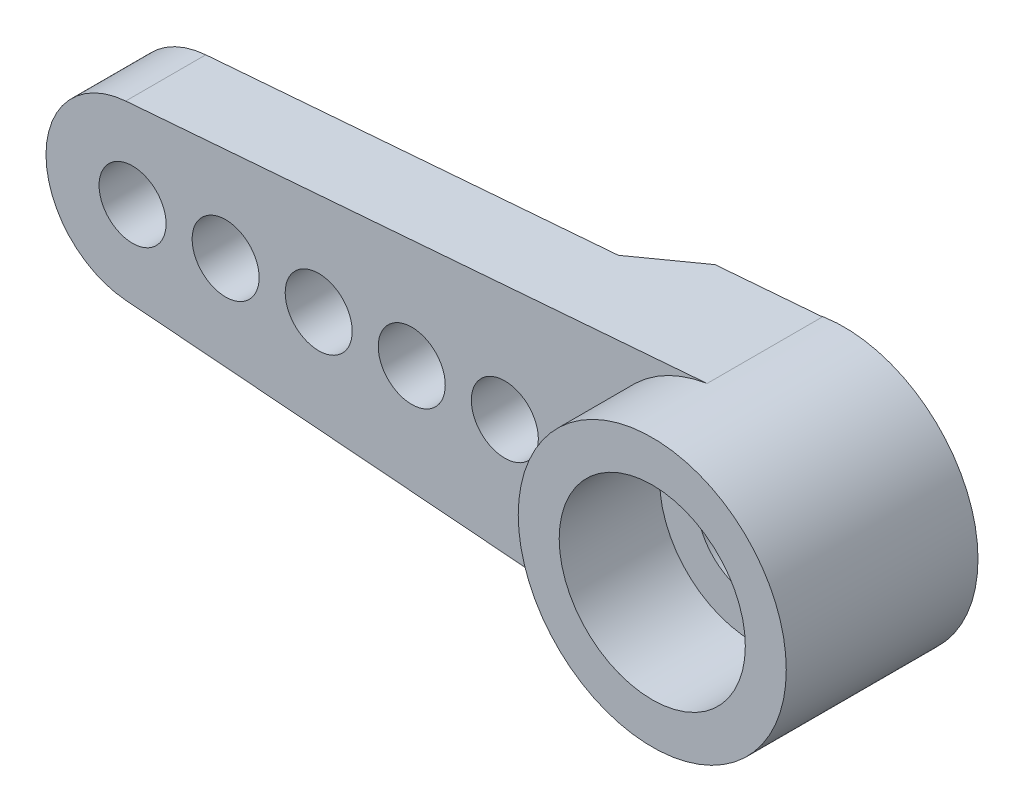
ISO-10303-21;
HEADER;
FILE_DESCRIPTION(('STEP AP214'),'2;1');
FILE_NAME('part.step','',(''),(''),'','','');
FILE_SCHEMA(('AUTOMOTIVE_DESIGN { 1 0 10303 214 1 1 1 1 }'));
ENDSEC;
DATA;
#1=APPLICATION_CONTEXT('core data for automotive mechanical design processes');
#2=APPLICATION_PROTOCOL_DEFINITION('international standard','automotive_design',2000,#1);
#3=PRODUCT_CONTEXT('',#1,'mechanical');
#4=PRODUCT('Part','Part','',(#3));
#5=PRODUCT_RELATED_PRODUCT_CATEGORY('part','',(#4));
#6=PRODUCT_DEFINITION_FORMATION('','',#4);
#7=PRODUCT_DEFINITION_CONTEXT('part definition',#1,'design');
#8=PRODUCT_DEFINITION('design','',#6,#7);
#9=PRODUCT_DEFINITION_SHAPE('','',#8);
#10=(LENGTH_UNIT() NAMED_UNIT(*) SI_UNIT(.MILLI.,.METRE.));
#11=(NAMED_UNIT(*) PLANE_ANGLE_UNIT() SI_UNIT($,.RADIAN.));
#12=(NAMED_UNIT(*) SI_UNIT($,.STERADIAN.) SOLID_ANGLE_UNIT());
#13=UNCERTAINTY_MEASURE_WITH_UNIT(LENGTH_MEASURE(1.E-05),#10,'distance_accuracy_value','');
#14=(GEOMETRIC_REPRESENTATION_CONTEXT(3) GLOBAL_UNCERTAINTY_ASSIGNED_CONTEXT((#13)) GLOBAL_UNIT_ASSIGNED_CONTEXT((#10,
#11,#12)) REPRESENTATION_CONTEXT('',''));
#15=CARTESIAN_POINT('',(0.,0.,0.));
#16=DIRECTION('',(0.,0.,1.));
#17=DIRECTION('',(1.,0.,0.));
#18=AXIS2_PLACEMENT_3D('',#15,#16,#17);
#19=CARTESIAN_POINT('',(0.,0.,-0.15));
#20=DIRECTION('',(0.,0.,1.));
#21=DIRECTION('',(1.,0.,0.));
#22=AXIS2_PLACEMENT_3D('',#19,#20,#21);
#23=CYLINDRICAL_SURFACE('',#22,3.6);
#24=CARTESIAN_POINT('',(0.,0.,2.8));
#25=DIRECTION('',(0.,0.,1.));
#26=DIRECTION('',(1.,0.,0.));
#27=AXIS2_PLACEMENT_3D('',#24,#25,#26);
#28=CIRCLE('',#27,3.6);
#29=CARTESIAN_POINT('',(3.6,0.,2.8));
#30=VERTEX_POINT('',#29);
#31=EDGE_CURVE('E185',#30,#30,#28,.T.);
#32=ORIENTED_EDGE('',*,*,#31,.F.);
#33=EDGE_LOOP('',(#32));
#34=FACE_BOUND('',#33,.T.);
#35=DIRECTION('',(0.,0.,1.));
#36=VECTOR('',#35,1.);
#37=CARTESIAN_POINT('',(-3.57770876399966,-0.400000000000002,-2.34));
#38=LINE('',#37,#36);
#39=CARTESIAN_POINT('',(-3.57770876399966,-0.400000000000002,-2.2688952548898));
#40=VERTEX_POINT('',#39);
#41=CARTESIAN_POINT('',(-3.57770876399966,-0.400000000000002,-1.39));
#42=VERTEX_POINT('',#41);
#43=EDGE_CURVE('E283',#40,#42,#38,.T.);
#44=ORIENTED_EDGE('',*,*,#43,.F.);
#45=CARTESIAN_POINT('',(0.,0.,-4.3344863728671));
#46=DIRECTION('',(-0.500000000000001,0.,-0.866025403784438));
#47=DIRECTION('',(-0.866025403784438,0.,0.500000000000001));
#48=AXIS2_PLACEMENT_3D('',#45,#46,#47);
#49=ELLIPSE('',#48,4.15692193816531,3.6);
#50=CARTESIAN_POINT('',(-3.43723122473388,-1.07025301107469,-2.35));
#51=VERTEX_POINT('',#50);
#52=EDGE_CURVE('E61',#40,#51,#49,.F.);
#53=ORIENTED_EDGE('',*,*,#52,.T.);
#54=CARTESIAN_POINT('',(0.,0.,-2.35));
#55=DIRECTION('',(0.,0.,-1.));
#56=DIRECTION('',(-1.,0.,0.));
#57=AXIS2_PLACEMENT_3D('',#54,#55,#56);
#58=CIRCLE('',#57,3.6);
#59=CARTESIAN_POINT('',(-3.43723122473388,1.07025301107469,-2.35));
#60=VERTEX_POINT('',#59);
#61=EDGE_CURVE('E182',#60,#51,#58,.T.);
#62=ORIENTED_EDGE('',*,*,#61,.F.);
#63=CARTESIAN_POINT('',(-3.57770876399966,0.399999999999998,-2.2688952548898));
#64=VERTEX_POINT('',#63);
#65=EDGE_CURVE('E356',#60,#64,#49,.F.);
#66=ORIENTED_EDGE('',*,*,#65,.T.);
#67=DIRECTION('',(0.,0.,1.));
#68=VECTOR('',#67,1.);
#69=CARTESIAN_POINT('',(-3.57770876399966,0.399999999999998,-2.34));
#70=LINE('',#69,#68);
#71=CARTESIAN_POINT('',(-3.57770876399966,0.399999999999998,-1.39));
#72=VERTEX_POINT('',#71);
#73=EDGE_CURVE('E279',#64,#72,#70,.T.);
#74=ORIENTED_EDGE('',*,*,#73,.T.);
#75=CARTESIAN_POINT('',(0.,0.,-1.39));
#76=DIRECTION('',(0.,0.,1.));
#77=DIRECTION('',(1.,0.,0.));
#78=AXIS2_PLACEMENT_3D('',#75,#76,#77);
#79=CIRCLE('',#78,3.6);
#80=CARTESIAN_POINT('',(-2.68692855753543,2.39591630210669,-1.39));
#81=VERTEX_POINT('',#80);
#82=EDGE_CURVE('E170',#72,#81,#79,.F.);
#83=ORIENTED_EDGE('',*,*,#82,.T.);
#84=DIRECTION('',(0.,0.,1.));
#85=VECTOR('',#84,1.);
#86=CARTESIAN_POINT('',(-2.68692855753543,2.39591630210669,-2.34));
#87=LINE('',#86,#85);
#88=CARTESIAN_POINT('',(-2.68692855753543,2.39591630210669,-2.34));
#89=VERTEX_POINT('',#88);
#90=EDGE_CURVE('E372',#89,#81,#87,.T.);
#91=ORIENTED_EDGE('',*,*,#90,.F.);
#92=CARTESIAN_POINT('',(0.,0.,-2.34));
#93=DIRECTION('',(0.,0.,-1.));
#94=DIRECTION('',(-1.,0.,0.));
#95=AXIS2_PLACEMENT_3D('',#92,#93,#94);
#96=CIRCLE('',#95,3.6);
#97=CARTESIAN_POINT('',(-0.566912183951404,3.55508235849571,-2.34));
#98=VERTEX_POINT('',#97);
#99=EDGE_CURVE('E269',#98,#89,#96,.F.);
#100=ORIENTED_EDGE('',*,*,#99,.F.);
#101=DIRECTION('',(0.,0.,1.));
#102=VECTOR('',#101,1.);
#103=CARTESIAN_POINT('',(-0.566912183951404,3.55508235849571,-6.44));
#104=LINE('',#103,#102);
#105=CARTESIAN_POINT('',(-0.566912183951404,3.55508235849571,0.76));
#106=VERTEX_POINT('',#105);
#107=EDGE_CURVE('E172',#98,#106,#104,.T.);
#108=ORIENTED_EDGE('',*,*,#107,.T.);
#109=CARTESIAN_POINT('',(0.,0.,0.76));
#110=DIRECTION('',(0.,0.,-1.));
#111=DIRECTION('',(-1.,0.,0.));
#112=AXIS2_PLACEMENT_3D('',#109,#110,#111);
#113=CIRCLE('',#112,3.6);
#114=CARTESIAN_POINT('',(-0.566912183951398,-3.55508235849572,0.76));
#115=VERTEX_POINT('',#114);
#116=EDGE_CURVE('E46',#106,#115,#113,.F.);
#117=ORIENTED_EDGE('',*,*,#116,.T.);
#118=DIRECTION('',(0.,0.,1.));
#119=VECTOR('',#118,1.);
#120=CARTESIAN_POINT('',(-0.566912183951398,-3.55508235849572,-6.44));
#121=LINE('',#120,#119);
#122=CARTESIAN_POINT('',(-0.566912183951395,-3.55508235849572,-2.34));
#123=VERTEX_POINT('',#122);
#124=EDGE_CURVE('E243',#123,#115,#121,.T.);
#125=ORIENTED_EDGE('',*,*,#124,.F.);
#126=CARTESIAN_POINT('',(0.,0.,-2.34));
#127=DIRECTION('',(0.,0.,-1.));
#128=DIRECTION('',(-1.,0.,0.));
#129=AXIS2_PLACEMENT_3D('',#126,#127,#128);
#130=CIRCLE('',#129,3.6);
#131=CARTESIAN_POINT('',(-2.68692855753543,-2.39591630210669,-2.34));
#132=VERTEX_POINT('',#131);
#133=EDGE_CURVE('E383',#132,#123,#130,.F.);
#134=ORIENTED_EDGE('',*,*,#133,.F.);
#135=DIRECTION('',(0.,0.,1.));
#136=VECTOR('',#135,1.);
#137=CARTESIAN_POINT('',(-2.68692855753543,-2.39591630210669,-2.34));
#138=LINE('',#137,#136);
#139=CARTESIAN_POINT('',(-2.68692855753543,-2.39591630210669,-1.39));
#140=VERTEX_POINT('',#139);
#141=EDGE_CURVE('E202',#132,#140,#138,.T.);
#142=ORIENTED_EDGE('',*,*,#141,.T.);
#143=EDGE_CURVE('E176',#140,#42,#79,.F.);
#144=ORIENTED_EDGE('',*,*,#143,.T.);
#145=EDGE_LOOP('',(#44,#53,#62,#66,#74,#83,#91,#100,#108,#117,#125,#134,#142,#144));
#146=FACE_BOUND('',#145,.T.);
#147=ADVANCED_FACE('F39',(#34,#146),#23,.T.);
#148=CARTESIAN_POINT('',(0.,0.,-2.35));
#149=DIRECTION('',(0.,0.,-1.));
#150=DIRECTION('',(-1.,0.,0.));
#151=AXIS2_PLACEMENT_3D('',#148,#149,#150);
#152=PLANE('',#151);
#153=CARTESIAN_POINT('',(0.,0.,-2.35));
#154=DIRECTION('',(0.,0.,-1.));
#155=DIRECTION('',(-1.,0.,0.));
#156=AXIS2_PLACEMENT_3D('',#153,#154,#155);
#157=CIRCLE('',#156,2.45);
#158=CARTESIAN_POINT('',(-2.45,0.,-2.35));
#159=VERTEX_POINT('',#158);
#160=EDGE_CURVE('E179',#159,#159,#157,.T.);
#161=ORIENTED_EDGE('',*,*,#160,.F.);
#162=EDGE_LOOP('',(#161));
#163=FACE_BOUND('',#162,.T.);
#164=ORIENTED_EDGE('',*,*,#61,.T.);
#165=DIRECTION('',(0.,1.,0.));
#166=VECTOR('',#165,1.);
#167=CARTESIAN_POINT('',(-3.43723122473388,0.,-2.35));
#168=LINE('',#167,#166);
#169=EDGE_CURVE('E354',#51,#60,#168,.T.);
#170=ORIENTED_EDGE('',*,*,#169,.T.);
#171=EDGE_LOOP('',(#164,#170));
#172=FACE_BOUND('',#171,.T.);
#173=ADVANCED_FACE('F313',(#163,#172),#152,.T.);
#174=CARTESIAN_POINT('',(-0.283456091975701,3.57754117924786,-6.44));
#175=DIRECTION('',(-0.0789845638086307,0.99687583914947,0.));
#176=DIRECTION('',(-0.99687583914947,-0.0789845638086307,0.));
#177=AXIS2_PLACEMENT_3D('',#174,#175,#176);
#178=PLANE('',#177);
#179=DIRECTION('',(0.99687583914947,0.0789845638086307,0.));
#180=VECTOR('',#179,1.);
#181=CARTESIAN_POINT('',(-0.283456091975701,3.57754117924786,-2.34));
#182=LINE('',#181,#180);
#183=CARTESIAN_POINT('',(-3.45455173280957,3.32628861985148,-2.34));
#184=VERTEX_POINT('',#183);
#185=EDGE_CURVE('E160',#184,#98,#182,.T.);
#186=ORIENTED_EDGE('',*,*,#185,.F.);
#187=DIRECTION('',(-0.863993823839445,-0.0684560429988286,0.498827066771879));
#188=VECTOR('',#187,1.);
#189=CARTESIAN_POINT('',(0.694517488461674,3.65502807744886,-4.73546623178735));
#190=LINE('',#189,#188);
#191=CARTESIAN_POINT('',(-5.1,3.19591630210669,-1.39));
#192=VERTEX_POINT('',#191);
#193=EDGE_CURVE('E144',#184,#192,#190,.T.);
#194=ORIENTED_EDGE('',*,*,#193,.T.);
#195=DIRECTION('',(-0.99687583914947,-0.0789845638086307,0.));
#196=VECTOR('',#195,1.);
#197=CARTESIAN_POINT('',(-18.2106783638103,2.15712975404036,-1.39));
#198=LINE('',#197,#196);
#199=CARTESIAN_POINT('',(-16.1836391108551,2.31773632602252,-1.39));
#200=VERTEX_POINT('',#199);
#201=EDGE_CURVE('E157',#192,#200,#198,.T.);
#202=ORIENTED_EDGE('',*,*,#201,.T.);
#203=DIRECTION('',(0.,0.,1.));
#204=VECTOR('',#203,1.);
#205=CARTESIAN_POINT('',(-16.1836391108551,2.31773632602252,-6.44));
#206=LINE('',#205,#204);
#207=CARTESIAN_POINT('',(-16.1836391108551,2.31773632602252,0.76));
#208=VERTEX_POINT('',#207);
#209=EDGE_CURVE('E245',#200,#208,#206,.T.);
#210=ORIENTED_EDGE('',*,*,#209,.T.);
#211=DIRECTION('',(-0.99687583914947,-0.0789845638086307,0.));
#212=VECTOR('',#211,1.);
#213=CARTESIAN_POINT('',(-0.283456091975701,3.57754117924786,0.76));
#214=LINE('',#213,#212);
#215=EDGE_CURVE('E240',#106,#208,#214,.T.);
#216=ORIENTED_EDGE('',*,*,#215,.F.);
#217=ORIENTED_EDGE('',*,*,#107,.F.);
#218=EDGE_LOOP('',(#186,#194,#202,#210,#216,#217));
#219=FACE_BOUND('',#218,.T.);
#220=ADVANCED_FACE('F156',(#219),#178,.T.);
#221=CARTESIAN_POINT('',(-0.283456091975701,-3.57754117924786,-6.44));
#222=DIRECTION('',(0.0789845638086307,0.99687583914947,0.));
#223=DIRECTION('',(-0.99687583914947,0.0789845638086307,0.));
#224=AXIS2_PLACEMENT_3D('',#221,#222,#223);
#225=PLANE('',#224);
#226=DIRECTION('',(-0.863993823839445,0.0684560429988286,0.498827066771879));
#227=VECTOR('',#226,1.);
#228=CARTESIAN_POINT('',(0.694517488461674,-3.65502807744886,-4.73546623178735));
#229=LINE('',#228,#227);
#230=CARTESIAN_POINT('',(-3.45455173280957,-3.32628861985148,-2.34));
#231=VERTEX_POINT('',#230);
#232=CARTESIAN_POINT('',(-5.1,-3.19591630210669,-1.39));
#233=VERTEX_POINT('',#232);
#234=EDGE_CURVE('E152',#231,#233,#229,.T.);
#235=ORIENTED_EDGE('',*,*,#234,.F.);
#236=DIRECTION('',(-0.99687583914947,0.0789845638086307,0.));
#237=VECTOR('',#236,1.);
#238=CARTESIAN_POINT('',(-0.283456091975701,-3.57754117924786,-2.34));
#239=LINE('',#238,#237);
#240=EDGE_CURVE('E256',#123,#231,#239,.T.);
#241=ORIENTED_EDGE('',*,*,#240,.F.);
#242=ORIENTED_EDGE('',*,*,#124,.T.);
#243=DIRECTION('',(-0.99687583914947,0.0789845638086307,0.));
#244=VECTOR('',#243,1.);
#245=CARTESIAN_POINT('',(-0.283456091975701,-3.57754117924786,0.76));
#246=LINE('',#245,#244);
#247=CARTESIAN_POINT('',(-16.1836391108551,-2.31773632602252,0.76));
#248=VERTEX_POINT('',#247);
#249=EDGE_CURVE('E233',#115,#248,#246,.T.);
#250=ORIENTED_EDGE('',*,*,#249,.T.);
#251=DIRECTION('',(0.,0.,1.));
#252=VECTOR('',#251,1.);
#253=CARTESIAN_POINT('',(-16.1836391108551,-2.31773632602252,-6.44));
#254=LINE('',#253,#252);
#255=CARTESIAN_POINT('',(-16.1836391108551,-2.31773632602252,-1.39));
#256=VERTEX_POINT('',#255);
#257=EDGE_CURVE('E247',#256,#248,#254,.T.);
#258=ORIENTED_EDGE('',*,*,#257,.F.);
#259=DIRECTION('',(-0.99687583914947,0.0789845638086307,0.));
#260=VECTOR('',#259,1.);
#261=CARTESIAN_POINT('',(-18.7775905477617,-2.11221211253607,-1.39));
#262=LINE('',#261,#260);
#263=EDGE_CURVE('E168',#233,#256,#262,.T.);
#264=ORIENTED_EDGE('',*,*,#263,.F.);
#265=EDGE_LOOP('',(#235,#241,#242,#250,#258,#264));
#266=FACE_BOUND('',#265,.T.);
#267=ADVANCED_FACE('F253',(#266),#225,.F.);
#268=CARTESIAN_POINT('',(-6.,0.,-6.8));
#269=DIRECTION('',(0.,0.,1.));
#270=DIRECTION('',(1.,0.,0.));
#271=AXIS2_PLACEMENT_3D('',#268,#269,#270);
#272=CYLINDRICAL_SURFACE('',#271,0.899999999999999);
#273=CARTESIAN_POINT('',(-6.,0.,0.760000000000001));
#274=DIRECTION('',(0.,0.,-1.));
#275=DIRECTION('',(-1.,0.,0.));
#276=AXIS2_PLACEMENT_3D('',#273,#274,#275);
#277=CIRCLE('',#276,0.899999999999999);
#278=CARTESIAN_POINT('',(-6.9,0.,0.760000000000001));
#279=VERTEX_POINT('',#278);
#280=EDGE_CURVE('E211',#279,#279,#277,.T.);
#281=ORIENTED_EDGE('',*,*,#280,.F.);
#282=EDGE_LOOP('',(#281));
#283=FACE_BOUND('',#282,.T.);
#284=CARTESIAN_POINT('',(-6.,0.,-1.39));
#285=DIRECTION('',(0.,0.,1.));
#286=DIRECTION('',(1.,0.,0.));
#287=AXIS2_PLACEMENT_3D('',#284,#285,#286);
#288=CIRCLE('',#287,0.899999999999999);
#289=CARTESIAN_POINT('',(-5.1,0.,-1.39));
#290=VERTEX_POINT('',#289);
#291=EDGE_CURVE('E213',#290,#290,#288,.T.);
#292=ORIENTED_EDGE('',*,*,#291,.F.);
#293=EDGE_LOOP('',(#292));
#294=FACE_BOUND('',#293,.T.);
#295=ADVANCED_FACE('F420',(#283,#294),#272,.F.);
#296=CARTESIAN_POINT('',(0.,-2.39591630210669,-2.34));
#297=DIRECTION('',(0.,-1.,0.));
#298=DIRECTION('',(1.,0.,0.));
#299=AXIS2_PLACEMENT_3D('',#296,#297,#298);
#300=PLANE('',#299);
#301=DIRECTION('',(0.866025403784438,0.,-0.500000000000001));
#302=VECTOR('',#301,1.);
#303=CARTESIAN_POINT('',(-0.863637933202396,-2.39591630210669,-3.83586477965032));
#304=LINE('',#303,#302);
#305=CARTESIAN_POINT('',(-5.1,-2.39591630210669,-1.39));
#306=VERTEX_POINT('',#305);
#307=CARTESIAN_POINT('',(-3.45455173280957,-2.39591630210669,-2.34));
#308=VERTEX_POINT('',#307);
#309=EDGE_CURVE('E53',#306,#308,#304,.T.);
#310=ORIENTED_EDGE('',*,*,#309,.F.);
#311=DIRECTION('',(1.,0.,0.));
#312=VECTOR('',#311,1.);
#313=CARTESIAN_POINT('',(0.,-2.39591630210669,-1.39));
#314=LINE('',#313,#312);
#315=EDGE_CURVE('E278',#306,#140,#314,.T.);
#316=ORIENTED_EDGE('',*,*,#315,.T.);
#317=ORIENTED_EDGE('',*,*,#141,.F.);
#318=DIRECTION('',(1.,0.,0.));
#319=VECTOR('',#318,1.);
#320=CARTESIAN_POINT('',(0.,-2.39591630210669,-2.34));
#321=LINE('',#320,#319);
#322=EDGE_CURVE('E281',#308,#132,#321,.T.);
#323=ORIENTED_EDGE('',*,*,#322,.F.);
#324=EDGE_LOOP('',(#310,#316,#317,#323));
#325=FACE_BOUND('',#324,.T.);
#326=ADVANCED_FACE('F389',(#325),#300,.F.);
#327=CARTESIAN_POINT('',(0.,0.,-2.34));
#328=DIRECTION('',(0.,0.,-1.));
#329=DIRECTION('',(-1.,0.,0.));
#330=AXIS2_PLACEMENT_3D('',#327,#328,#329);
#331=PLANE('',#330);
#332=ORIENTED_EDGE('',*,*,#240,.T.);
#333=DIRECTION('',(0.,1.,0.));
#334=VECTOR('',#333,1.);
#335=CARTESIAN_POINT('',(-3.45455173280957,0.,-2.34));
#336=LINE('',#335,#334);
#337=EDGE_CURVE('E362',#231,#308,#336,.T.);
#338=ORIENTED_EDGE('',*,*,#337,.T.);
#339=ORIENTED_EDGE('',*,*,#322,.T.);
#340=ORIENTED_EDGE('',*,*,#133,.T.);
#341=EDGE_LOOP('',(#332,#338,#339,#340));
#342=FACE_BOUND('',#341,.T.);
#343=ADVANCED_FACE('F385',(#342),#331,.T.);
#344=CARTESIAN_POINT('',(0.,0.399999999999997,-2.34));
#345=DIRECTION('',(0.,-1.,0.));
#346=DIRECTION('',(1.,0.,0.));
#347=AXIS2_PLACEMENT_3D('',#344,#345,#346);
#348=PLANE('',#347);
#349=DIRECTION('',(0.866025403784438,0.,-0.500000000000001));
#350=VECTOR('',#349,1.);
#351=CARTESIAN_POINT('',(-0.863637933202395,0.399999999999998,-3.83586477965032));
#352=LINE('',#351,#350);
#353=CARTESIAN_POINT('',(-5.1,0.399999999999998,-1.39));
#354=VERTEX_POINT('',#353);
#355=EDGE_CURVE('E361',#354,#64,#352,.T.);
#356=ORIENTED_EDGE('',*,*,#355,.F.);
#357=DIRECTION('',(1.,0.,0.));
#358=VECTOR('',#357,1.);
#359=CARTESIAN_POINT('',(0.,0.399999999999997,-1.39));
#360=LINE('',#359,#358);
#361=EDGE_CURVE('E376',#354,#72,#360,.T.);
#362=ORIENTED_EDGE('',*,*,#361,.T.);
#363=ORIENTED_EDGE('',*,*,#73,.F.);
#364=EDGE_LOOP('',(#356,#362,#363));
#365=FACE_BOUND('',#364,.T.);
#366=ADVANCED_FACE('F407',(#365),#348,.F.);
#367=CARTESIAN_POINT('',(0.,-0.400000000000002,-2.34));
#368=DIRECTION('',(0.,-1.,0.));
#369=DIRECTION('',(1.,0.,0.));
#370=AXIS2_PLACEMENT_3D('',#367,#368,#369);
#371=PLANE('',#370);
#372=DIRECTION('',(1.,0.,0.));
#373=VECTOR('',#372,1.);
#374=CARTESIAN_POINT('',(0.,-0.400000000000002,-1.39));
#375=LINE('',#374,#373);
#376=CARTESIAN_POINT('',(-5.1,-0.400000000000001,-1.39));
#377=VERTEX_POINT('',#376);
#378=EDGE_CURVE('E379',#377,#42,#375,.T.);
#379=ORIENTED_EDGE('',*,*,#378,.F.);
#380=DIRECTION('',(0.866025403784438,0.,-0.500000000000001));
#381=VECTOR('',#380,1.);
#382=CARTESIAN_POINT('',(-0.863637933202395,-0.400000000000002,-3.83586477965032));
#383=LINE('',#382,#381);
#384=EDGE_CURVE('E161',#377,#40,#383,.T.);
#385=ORIENTED_EDGE('',*,*,#384,.T.);
#386=ORIENTED_EDGE('',*,*,#43,.T.);
#387=EDGE_LOOP('',(#379,#385,#386));
#388=FACE_BOUND('',#387,.T.);
#389=ADVANCED_FACE('F394',(#388),#371,.T.);
#390=CARTESIAN_POINT('',(0.,2.39591630210669,-2.34));
#391=DIRECTION('',(0.,-1.,0.));
#392=DIRECTION('',(1.,0.,0.));
#393=AXIS2_PLACEMENT_3D('',#390,#391,#392);
#394=PLANE('',#393);
#395=DIRECTION('',(1.,0.,0.));
#396=VECTOR('',#395,1.);
#397=CARTESIAN_POINT('',(0.,2.39591630210669,-1.39));
#398=LINE('',#397,#396);
#399=CARTESIAN_POINT('',(-5.1,2.39591630210669,-1.39));
#400=VERTEX_POINT('',#399);
#401=EDGE_CURVE('E151',#400,#81,#398,.T.);
#402=ORIENTED_EDGE('',*,*,#401,.F.);
#403=DIRECTION('',(0.866025403784438,0.,-0.500000000000001));
#404=VECTOR('',#403,1.);
#405=CARTESIAN_POINT('',(-0.863637933202396,2.39591630210669,-3.83586477965032));
#406=LINE('',#405,#404);
#407=CARTESIAN_POINT('',(-3.45455173280957,2.39591630210669,-2.34));
#408=VERTEX_POINT('',#407);
#409=EDGE_CURVE('E146',#400,#408,#406,.T.);
#410=ORIENTED_EDGE('',*,*,#409,.T.);
#411=DIRECTION('',(1.,0.,0.));
#412=VECTOR('',#411,1.);
#413=CARTESIAN_POINT('',(0.,2.39591630210669,-2.34));
#414=LINE('',#413,#412);
#415=EDGE_CURVE('E371',#408,#89,#414,.T.);
#416=ORIENTED_EDGE('',*,*,#415,.T.);
#417=ORIENTED_EDGE('',*,*,#90,.T.);
#418=EDGE_LOOP('',(#402,#410,#416,#417));
#419=FACE_BOUND('',#418,.T.);
#420=ADVANCED_FACE('F403',(#419),#394,.T.);
#421=CARTESIAN_POINT('',(0.,0.,-2.34));
#422=DIRECTION('',(0.,0.,-1.));
#423=DIRECTION('',(-1.,0.,0.));
#424=AXIS2_PLACEMENT_3D('',#421,#422,#423);
#425=PLANE('',#424);
#426=ORIENTED_EDGE('',*,*,#415,.F.);
#427=DIRECTION('',(0.,1.,0.));
#428=VECTOR('',#427,1.);
#429=CARTESIAN_POINT('',(-3.45455173280957,0.,-2.34));
#430=LINE('',#429,#428);
#431=EDGE_CURVE('E11',#408,#184,#430,.T.);
#432=ORIENTED_EDGE('',*,*,#431,.T.);
#433=ORIENTED_EDGE('',*,*,#185,.T.);
#434=ORIENTED_EDGE('',*,*,#99,.T.);
#435=EDGE_LOOP('',(#426,#432,#433,#434));
#436=FACE_BOUND('',#435,.T.);
#437=ADVANCED_FACE('F346',(#436),#425,.T.);
#438=CARTESIAN_POINT('',(-18.325,3.6,-1.39));
#439=DIRECTION('',(0.,0.,1.));
#440=DIRECTION('',(1.,0.,0.));
#441=AXIS2_PLACEMENT_3D('',#438,#439,#440);
#442=PLANE('',#441);
#443=DIRECTION('',(0.,-1.,0.));
#444=VECTOR('',#443,1.);
#445=CARTESIAN_POINT('',(-5.1,0.,-1.39));
#446=LINE('',#445,#444);
#447=EDGE_CURVE('E141',#192,#400,#446,.T.);
#448=ORIENTED_EDGE('',*,*,#447,.T.);
#449=ORIENTED_EDGE('',*,*,#401,.T.);
#450=ORIENTED_EDGE('',*,*,#82,.F.);
#451=ORIENTED_EDGE('',*,*,#361,.F.);
#452=DIRECTION('',(0.,-1.,0.));
#453=VECTOR('',#452,1.);
#454=CARTESIAN_POINT('',(-5.1,12.,-1.39));
#455=LINE('',#454,#453);
#456=EDGE_CURVE('E396',#354,#290,#455,.T.);
#457=ORIENTED_EDGE('',*,*,#456,.T.);
#458=ORIENTED_EDGE('',*,*,#291,.T.);
#459=EDGE_CURVE('E392',#290,#377,#455,.T.);
#460=ORIENTED_EDGE('',*,*,#459,.T.);
#461=ORIENTED_EDGE('',*,*,#378,.T.);
#462=ORIENTED_EDGE('',*,*,#143,.F.);
#463=ORIENTED_EDGE('',*,*,#315,.F.);
#464=DIRECTION('',(0.,1.,0.));
#465=VECTOR('',#464,1.);
#466=CARTESIAN_POINT('',(-5.1,0.,-1.39));
#467=LINE('',#466,#465);
#468=EDGE_CURVE('E275',#233,#306,#467,.T.);
#469=ORIENTED_EDGE('',*,*,#468,.F.);
#470=ORIENTED_EDGE('',*,*,#263,.T.);
#471=CARTESIAN_POINT('',(-16.,0.,-1.39));
#472=DIRECTION('',(0.,0.,1.));
#473=DIRECTION('',(1.,0.,0.));
#474=AXIS2_PLACEMENT_3D('',#471,#472,#473);
#475=CIRCLE('',#474,2.325);
#476=EDGE_CURVE('E167',#200,#256,#475,.T.);
#477=ORIENTED_EDGE('',*,*,#476,.F.);
#478=ORIENTED_EDGE('',*,*,#201,.F.);
#479=EDGE_LOOP('',(#448,#449,#450,#451,#457,#458,#460,#461,#462,#463,#469,#470,#477,#478));
#480=FACE_BOUND('',#479,.T.);
#481=CARTESIAN_POINT('',(-8.5,0.,-1.39));
#482=DIRECTION('',(0.,0.,1.));
#483=DIRECTION('',(1.,0.,0.));
#484=AXIS2_PLACEMENT_3D('',#481,#482,#483);
#485=CIRCLE('',#484,0.899999999999999);
#486=CARTESIAN_POINT('',(-7.6,0.,-1.39));
#487=VERTEX_POINT('',#486);
#488=EDGE_CURVE('E197',#487,#487,#485,.T.);
#489=ORIENTED_EDGE('',*,*,#488,.T.);
#490=EDGE_LOOP('',(#489));
#491=FACE_BOUND('',#490,.T.);
#492=CARTESIAN_POINT('',(-11.,0.,-1.39));
#493=DIRECTION('',(0.,0.,1.));
#494=DIRECTION('',(1.,0.,0.));
#495=AXIS2_PLACEMENT_3D('',#492,#493,#494);
#496=CIRCLE('',#495,0.9);
#497=CARTESIAN_POINT('',(-10.1,0.,-1.39));
#498=VERTEX_POINT('',#497);
#499=EDGE_CURVE('E210',#498,#498,#496,.T.);
#500=ORIENTED_EDGE('',*,*,#499,.T.);
#501=EDGE_LOOP('',(#500));
#502=FACE_BOUND('',#501,.T.);
#503=CARTESIAN_POINT('',(-13.5,0.,-1.39));
#504=DIRECTION('',(0.,0.,1.));
#505=DIRECTION('',(1.,0.,0.));
#506=AXIS2_PLACEMENT_3D('',#503,#504,#505);
#507=CIRCLE('',#506,0.9);
#508=CARTESIAN_POINT('',(-12.6,0.,-1.39));
#509=VERTEX_POINT('',#508);
#510=EDGE_CURVE('E206',#509,#509,#507,.T.);
#511=ORIENTED_EDGE('',*,*,#510,.T.);
#512=EDGE_LOOP('',(#511));
#513=FACE_BOUND('',#512,.T.);
#514=CARTESIAN_POINT('',(-16.,0.,-1.39));
#515=DIRECTION('',(0.,0.,1.));
#516=DIRECTION('',(1.,0.,0.));
#517=AXIS2_PLACEMENT_3D('',#514,#515,#516);
#518=CIRCLE('',#517,0.9);
#519=CARTESIAN_POINT('',(-15.1,0.,-1.39));
#520=VERTEX_POINT('',#519);
#521=EDGE_CURVE('E201',#520,#520,#518,.T.);
#522=ORIENTED_EDGE('',*,*,#521,.T.);
#523=EDGE_LOOP('',(#522));
#524=FACE_BOUND('',#523,.T.);
#525=ADVANCED_FACE('F164',(#480,#491,#502,#513,#524),#442,.F.);
#526=CARTESIAN_POINT('',(0.,0.,-0.15));
#527=DIRECTION('',(0.,0.,1.));
#528=DIRECTION('',(1.,0.,0.));
#529=AXIS2_PLACEMENT_3D('',#526,#527,#528);
#530=CYLINDRICAL_SURFACE('',#529,2.45);
#531=ORIENTED_EDGE('',*,*,#160,.T.);
#532=EDGE_LOOP('',(#531));
#533=FACE_BOUND('',#532,.T.);
#534=CARTESIAN_POINT('',(0.,0.,-1.39));
#535=DIRECTION('',(0.,0.,1.));
#536=DIRECTION('',(1.,0.,0.));
#537=AXIS2_PLACEMENT_3D('',#534,#535,#536);
#538=CIRCLE('',#537,2.45);
#539=CARTESIAN_POINT('',(2.45,0.,-1.39));
#540=VERTEX_POINT('',#539);
#541=EDGE_CURVE('E188',#540,#540,#538,.F.);
#542=ORIENTED_EDGE('',*,*,#541,.F.);
#543=EDGE_LOOP('',(#542));
#544=FACE_BOUND('',#543,.T.);
#545=ADVANCED_FACE('F337',(#533,#544),#530,.F.);
#546=CARTESIAN_POINT('',(0.,0.,-1.39));
#547=DIRECTION('',(0.,0.,1.));
#548=DIRECTION('',(1.,0.,0.));
#549=AXIS2_PLACEMENT_3D('',#546,#547,#548);
#550=CIRCLE('',#549,1.5);
#551=CARTESIAN_POINT('',(1.5,0.,-1.39));
#552=VERTEX_POINT('',#551);
#553=EDGE_CURVE('E196',#552,#552,#550,.T.);
#554=ORIENTED_EDGE('',*,*,#553,.T.);
#555=EDGE_LOOP('',(#554));
#556=FACE_BOUND('',#555,.T.);
#557=ORIENTED_EDGE('',*,*,#541,.T.);
#558=EDGE_LOOP('',(#557));
#559=FACE_BOUND('',#558,.T.);
#560=ADVANCED_FACE('F334',(#556,#559),#442,.F.);
#561=CARTESIAN_POINT('',(-16.,0.,-6.44));
#562=DIRECTION('',(0.,0.,1.));
#563=DIRECTION('',(1.,0.,0.));
#564=AXIS2_PLACEMENT_3D('',#561,#562,#563);
#565=CYLINDRICAL_SURFACE('',#564,2.325);
#566=ORIENTED_EDGE('',*,*,#476,.T.);
#567=ORIENTED_EDGE('',*,*,#257,.T.);
#568=CARTESIAN_POINT('',(-16.,0.,0.76));
#569=DIRECTION('',(0.,0.,1.));
#570=DIRECTION('',(1.,0.,0.));
#571=AXIS2_PLACEMENT_3D('',#568,#569,#570);
#572=CIRCLE('',#571,2.325);
#573=EDGE_CURVE('E238',#208,#248,#572,.T.);
#574=ORIENTED_EDGE('',*,*,#573,.F.);
#575=ORIENTED_EDGE('',*,*,#209,.F.);
#576=EDGE_LOOP('',(#566,#567,#574,#575));
#577=FACE_BOUND('',#576,.T.);
#578=ADVANCED_FACE('F271',(#577),#565,.T.);
#579=CARTESIAN_POINT('',(0.,0.,2.8));
#580=DIRECTION('',(0.,0.,1.));
#581=DIRECTION('',(1.,0.,0.));
#582=AXIS2_PLACEMENT_3D('',#579,#580,#581);
#583=PLANE('',#582);
#584=CARTESIAN_POINT('',(0.,0.,2.8));
#585=DIRECTION('',(0.,0.,1.));
#586=DIRECTION('',(1.,0.,0.));
#587=AXIS2_PLACEMENT_3D('',#584,#585,#586);
#588=CIRCLE('',#587,2.5);
#589=CARTESIAN_POINT('',(2.5,0.,2.8));
#590=VERTEX_POINT('',#589);
#591=EDGE_CURVE('E229',#590,#590,#588,.T.);
#592=ORIENTED_EDGE('',*,*,#591,.F.);
#593=EDGE_LOOP('',(#592));
#594=FACE_BOUND('',#593,.T.);
#595=ORIENTED_EDGE('',*,*,#31,.T.);
#596=EDGE_LOOP('',(#595));
#597=FACE_BOUND('',#596,.T.);
#598=ADVANCED_FACE('F323',(#594,#597),#583,.T.);
#599=CARTESIAN_POINT('',(3.675,3.6,0.759999999999999));
#600=DIRECTION('',(0.,0.,-1.));
#601=DIRECTION('',(-1.,0.,0.));
#602=AXIS2_PLACEMENT_3D('',#599,#600,#601);
#603=PLANE('',#602);
#604=CARTESIAN_POINT('',(-8.5,0.,0.760000000000001));
#605=DIRECTION('',(0.,0.,-1.));
#606=DIRECTION('',(-1.,0.,0.));
#607=AXIS2_PLACEMENT_3D('',#604,#605,#606);
#608=CIRCLE('',#607,0.899999999999999);
#609=CARTESIAN_POINT('',(-9.4,0.,0.760000000000001));
#610=VERTEX_POINT('',#609);
#611=EDGE_CURVE('E214',#610,#610,#608,.T.);
#612=ORIENTED_EDGE('',*,*,#611,.T.);
#613=EDGE_LOOP('',(#612));
#614=FACE_BOUND('',#613,.T.);
#615=ORIENTED_EDGE('',*,*,#280,.T.);
#616=EDGE_LOOP('',(#615));
#617=FACE_BOUND('',#616,.T.);
#618=CARTESIAN_POINT('',(-11.,0.,0.760000000000002));
#619=DIRECTION('',(0.,0.,-1.));
#620=DIRECTION('',(-1.,0.,0.));
#621=AXIS2_PLACEMENT_3D('',#618,#619,#620);
#622=CIRCLE('',#621,0.9);
#623=CARTESIAN_POINT('',(-11.9,0.,0.760000000000002));
#624=VERTEX_POINT('',#623);
#625=EDGE_CURVE('E207',#624,#624,#622,.T.);
#626=ORIENTED_EDGE('',*,*,#625,.T.);
#627=EDGE_LOOP('',(#626));
#628=FACE_BOUND('',#627,.T.);
#629=CARTESIAN_POINT('',(-13.5,0.,0.760000000000003));
#630=DIRECTION('',(0.,0.,-1.));
#631=DIRECTION('',(-1.,0.,0.));
#632=AXIS2_PLACEMENT_3D('',#629,#630,#631);
#633=CIRCLE('',#632,0.9);
#634=CARTESIAN_POINT('',(-14.4,0.,0.760000000000003));
#635=VERTEX_POINT('',#634);
#636=EDGE_CURVE('E203',#635,#635,#633,.T.);
#637=ORIENTED_EDGE('',*,*,#636,.T.);
#638=EDGE_LOOP('',(#637));
#639=FACE_BOUND('',#638,.T.);
#640=CARTESIAN_POINT('',(-16.,0.,0.760000000000003));
#641=DIRECTION('',(0.,0.,-1.));
#642=DIRECTION('',(-1.,0.,0.));
#643=AXIS2_PLACEMENT_3D('',#640,#641,#642);
#644=CIRCLE('',#643,0.9);
#645=CARTESIAN_POINT('',(-16.9,0.,0.760000000000003));
#646=VERTEX_POINT('',#645);
#647=EDGE_CURVE('E198',#646,#646,#644,.T.);
#648=ORIENTED_EDGE('',*,*,#647,.T.);
#649=EDGE_LOOP('',(#648));
#650=FACE_BOUND('',#649,.T.);
#651=ORIENTED_EDGE('',*,*,#215,.T.);
#652=ORIENTED_EDGE('',*,*,#573,.T.);
#653=ORIENTED_EDGE('',*,*,#249,.F.);
#654=ORIENTED_EDGE('',*,*,#116,.F.);
#655=EDGE_LOOP('',(#651,#652,#653,#654));
#656=FACE_BOUND('',#655,.T.);
#657=ADVANCED_FACE('F262',(#614,#617,#628,#639,#650,#656),#603,.F.);
#658=CARTESIAN_POINT('',(0.,0.,0.0999999999999998));
#659=DIRECTION('',(0.,0.,1.));
#660=DIRECTION('',(1.,0.,0.));
#661=AXIS2_PLACEMENT_3D('',#658,#659,#660);
#662=CYLINDRICAL_SURFACE('',#661,2.5);
#663=CARTESIAN_POINT('',(0.,0.,0.0999999999999998));
#664=DIRECTION('',(0.,0.,1.));
#665=DIRECTION('',(1.,0.,0.));
#666=AXIS2_PLACEMENT_3D('',#663,#664,#665);
#667=CIRCLE('',#666,2.5);
#668=CARTESIAN_POINT('',(2.5,0.,0.0999999999999998));
#669=VERTEX_POINT('',#668);
#670=EDGE_CURVE('E230',#669,#669,#667,.T.);
#671=CARTESIAN_POINT('',(2.5,0.,0.0999999999999998));
#672=CARTESIAN_POINT('',(2.5,0.,0.128125));
#673=CARTESIAN_POINT('',(2.5,0.,0.15625));
#674=CARTESIAN_POINT('',(2.5,0.,0.2125));
#675=CARTESIAN_POINT('',(2.5,0.,0.240625));
#676=CARTESIAN_POINT('',(2.5,0.,0.296875));
#677=CARTESIAN_POINT('',(2.5,0.,0.325));
#678=CARTESIAN_POINT('',(2.5,0.,0.38125));
#679=CARTESIAN_POINT('',(2.5,0.,0.409375));
#680=CARTESIAN_POINT('',(2.5,0.,0.465625));
#681=CARTESIAN_POINT('',(2.5,0.,0.49375));
#682=CARTESIAN_POINT('',(2.5,0.,0.55));
#683=CARTESIAN_POINT('',(2.5,0.,0.578125));
#684=CARTESIAN_POINT('',(2.5,0.,0.634375));
#685=CARTESIAN_POINT('',(2.5,0.,0.6625));
#686=CARTESIAN_POINT('',(2.5,0.,0.71875));
#687=CARTESIAN_POINT('',(2.5,0.,0.746875));
#688=CARTESIAN_POINT('',(2.5,0.,0.803125));
#689=CARTESIAN_POINT('',(2.5,0.,0.83125));
#690=CARTESIAN_POINT('',(2.5,0.,0.8875));
#691=CARTESIAN_POINT('',(2.5,0.,0.915625));
#692=CARTESIAN_POINT('',(2.5,0.,0.971875));
#693=CARTESIAN_POINT('',(2.5,0.,1.));
#694=CARTESIAN_POINT('',(2.5,0.,1.05625));
#695=CARTESIAN_POINT('',(2.5,0.,1.084375));
#696=CARTESIAN_POINT('',(2.5,0.,1.140625));
#697=CARTESIAN_POINT('',(2.5,0.,1.16875));
#698=CARTESIAN_POINT('',(2.5,0.,1.225));
#699=CARTESIAN_POINT('',(2.5,0.,1.253125));
#700=CARTESIAN_POINT('',(2.5,0.,1.309375));
#701=CARTESIAN_POINT('',(2.5,0.,1.3375));
#702=CARTESIAN_POINT('',(2.5,0.,1.39375));
#703=CARTESIAN_POINT('',(2.5,0.,1.421875));
#704=CARTESIAN_POINT('',(2.5,0.,1.478125));
#705=CARTESIAN_POINT('',(2.5,0.,1.50625));
#706=CARTESIAN_POINT('',(2.5,0.,1.5625));
#707=CARTESIAN_POINT('',(2.5,0.,1.590625));
#708=CARTESIAN_POINT('',(2.5,0.,1.646875));
#709=CARTESIAN_POINT('',(2.5,0.,1.675));
#710=CARTESIAN_POINT('',(2.5,0.,1.73125));
#711=CARTESIAN_POINT('',(2.5,0.,1.759375));
#712=CARTESIAN_POINT('',(2.5,0.,1.815625));
#713=CARTESIAN_POINT('',(2.5,0.,1.84375));
#714=CARTESIAN_POINT('',(2.5,0.,1.9));
#715=CARTESIAN_POINT('',(2.5,0.,1.928125));
#716=CARTESIAN_POINT('',(2.5,0.,1.984375));
#717=CARTESIAN_POINT('',(2.5,0.,2.0125));
#718=CARTESIAN_POINT('',(2.5,0.,2.06875));
#719=CARTESIAN_POINT('',(2.5,0.,2.096875));
#720=CARTESIAN_POINT('',(2.5,0.,2.153125));
#721=CARTESIAN_POINT('',(2.5,0.,2.18125));
#722=CARTESIAN_POINT('',(2.5,0.,2.2375));
#723=CARTESIAN_POINT('',(2.5,0.,2.265625));
#724=CARTESIAN_POINT('',(2.5,0.,2.321875));
#725=CARTESIAN_POINT('',(2.5,0.,2.35));
#726=CARTESIAN_POINT('',(2.5,0.,2.40625));
#727=CARTESIAN_POINT('',(2.5,0.,2.434375));
#728=CARTESIAN_POINT('',(2.5,0.,2.490625));
#729=CARTESIAN_POINT('',(2.5,0.,2.51875));
#730=CARTESIAN_POINT('',(2.5,0.,2.575));
#731=CARTESIAN_POINT('',(2.5,0.,2.603125));
#732=CARTESIAN_POINT('',(2.5,0.,2.659375));
#733=CARTESIAN_POINT('',(2.5,0.,2.6875));
#734=CARTESIAN_POINT('',(2.5,0.,2.74375));
#735=CARTESIAN_POINT('',(2.5,0.,2.771875));
#736=CARTESIAN_POINT('',(2.5,0.,2.8));
#737=B_SPLINE_CURVE_WITH_KNOTS('',3,(#671,#672,#673,#674,#675,#676,#677,#678,#679,#680,#681,
#682,#683,#684,#685,#686,#687,#688,#689,#690,#691,#692,#693,#694,#695,#696,#697,#698,#699,#700,
#701,#702,#703,#704,#705,#706,#707,#708,#709,#710,#711,#712,#713,#714,#715,#716,#717,#718,#719,
#720,#721,#722,#723,#724,#725,#726,#727,#728,#729,#730,#731,#732,#733,#734,#735,#736),
.UNSPECIFIED.,.F.,.F.,(4,2,2,2,2,2,2,2,2,2,2,2,2,2,2,2,2,2,2,2,2,2,2,2,2,2,2,2,2,2,2,2,4),(0.,
0.084375,0.16875,0.253125,0.3375,0.421875,0.50625,0.590625,0.675,0.759375,0.84375,0.928125,
1.0125,1.096875,1.18125,1.265625,1.35,1.434375,1.51875,1.603125,1.6875,1.771875,1.85625,
1.940625,2.025,2.109375,2.19375,2.278125,2.3625,2.446875,2.53125,2.615625,2.7),.UNSPECIFIED.);
#738=EDGE_CURVE('BSEAM332',#669,#590,#737,.T.);
#739=ORIENTED_EDGE('',*,*,#670,.F.);
#740=ORIENTED_EDGE('',*,*,#591,.T.);
#741=ORIENTED_EDGE('',*,*,#738,.T.);
#742=ORIENTED_EDGE('',*,*,#738,.F.);
#743=EDGE_LOOP('',(#739,#741,#740,#742));
#744=FACE_BOUND('',#743,.T.);
#745=ADVANCED_FACE('F332',(#744),#662,.F.);
#746=CARTESIAN_POINT('',(0.,0.,0.0999999999999998));
#747=DIRECTION('',(0.,0.,1.));
#748=DIRECTION('',(1.,0.,0.));
#749=AXIS2_PLACEMENT_3D('',#746,#747,#748);
#750=PLANE('',#749);
#751=CARTESIAN_POINT('',(0.,0.,0.0999999999999994));
#752=DIRECTION('',(0.,0.,1.));
#753=DIRECTION('',(1.,0.,0.));
#754=AXIS2_PLACEMENT_3D('',#751,#752,#753);
#755=CIRCLE('',#754,1.5);
#756=CARTESIAN_POINT('',(1.5,0.,0.0999999999999994));
#757=VERTEX_POINT('',#756);
#758=EDGE_CURVE('E193',#757,#757,#755,.T.);
#759=ORIENTED_EDGE('',*,*,#758,.F.);
#760=EDGE_LOOP('',(#759));
#761=FACE_BOUND('',#760,.T.);
#762=ORIENTED_EDGE('',*,*,#670,.T.);
#763=EDGE_LOOP('',(#762));
#764=FACE_BOUND('',#763,.T.);
#765=ADVANCED_FACE('F449',(#761,#764),#750,.T.);
#766=CARTESIAN_POINT('',(0.,0.,-6.8));
#767=DIRECTION('',(0.,0.,1.));
#768=DIRECTION('',(1.,0.,0.));
#769=AXIS2_PLACEMENT_3D('',#766,#767,#768);
#770=CYLINDRICAL_SURFACE('',#769,1.5);
#771=ORIENTED_EDGE('',*,*,#758,.T.);
#772=EDGE_LOOP('',(#771));
#773=FACE_BOUND('',#772,.T.);
#774=ORIENTED_EDGE('',*,*,#553,.F.);
#775=EDGE_LOOP('',(#774));
#776=FACE_BOUND('',#775,.T.);
#777=ADVANCED_FACE('F308',(#773,#776),#770,.F.);
#778=CARTESIAN_POINT('',(-16.,0.,-6.8));
#779=DIRECTION('',(0.,0.,1.));
#780=DIRECTION('',(1.,0.,0.));
#781=AXIS2_PLACEMENT_3D('',#778,#779,#780);
#782=CYLINDRICAL_SURFACE('',#781,0.9);
#783=ORIENTED_EDGE('',*,*,#647,.F.);
#784=EDGE_LOOP('',(#783));
#785=FACE_BOUND('',#784,.T.);
#786=ORIENTED_EDGE('',*,*,#521,.F.);
#787=EDGE_LOOP('',(#786));
#788=FACE_BOUND('',#787,.T.);
#789=ADVANCED_FACE('F298',(#785,#788),#782,.F.);
#790=CARTESIAN_POINT('',(-13.5,0.,-6.8));
#791=DIRECTION('',(0.,0.,1.));
#792=DIRECTION('',(1.,0.,0.));
#793=AXIS2_PLACEMENT_3D('',#790,#791,#792);
#794=CYLINDRICAL_SURFACE('',#793,0.9);
#795=ORIENTED_EDGE('',*,*,#636,.F.);
#796=EDGE_LOOP('',(#795));
#797=FACE_BOUND('',#796,.T.);
#798=ORIENTED_EDGE('',*,*,#510,.F.);
#799=EDGE_LOOP('',(#798));
#800=FACE_BOUND('',#799,.T.);
#801=ADVANCED_FACE('F295',(#797,#800),#794,.F.);
#802=CARTESIAN_POINT('',(-11.,0.,-6.8));
#803=DIRECTION('',(0.,0.,1.));
#804=DIRECTION('',(1.,0.,0.));
#805=AXIS2_PLACEMENT_3D('',#802,#803,#804);
#806=CYLINDRICAL_SURFACE('',#805,0.9);
#807=ORIENTED_EDGE('',*,*,#625,.F.);
#808=EDGE_LOOP('',(#807));
#809=FACE_BOUND('',#808,.T.);
#810=ORIENTED_EDGE('',*,*,#499,.F.);
#811=EDGE_LOOP('',(#810));
#812=FACE_BOUND('',#811,.T.);
#813=ADVANCED_FACE('F297',(#809,#812),#806,.F.);
#814=CARTESIAN_POINT('',(-8.5,0.,-6.8));
#815=DIRECTION('',(0.,0.,1.));
#816=DIRECTION('',(1.,0.,0.));
#817=AXIS2_PLACEMENT_3D('',#814,#815,#816);
#818=CYLINDRICAL_SURFACE('',#817,0.899999999999999);
#819=ORIENTED_EDGE('',*,*,#611,.F.);
#820=EDGE_LOOP('',(#819));
#821=FACE_BOUND('',#820,.T.);
#822=ORIENTED_EDGE('',*,*,#488,.F.);
#823=EDGE_LOOP('',(#822));
#824=FACE_BOUND('',#823,.T.);
#825=ADVANCED_FACE('F305',(#821,#824),#818,.F.);
#826=CARTESIAN_POINT('',(-5.1,12.,-1.39));
#827=DIRECTION('',(-0.500000000000001,0.,-0.866025403784438));
#828=DIRECTION('',(-0.866025403784438,0.,0.500000000000001));
#829=AXIS2_PLACEMENT_3D('',#826,#827,#828);
#830=PLANE('',#829);
#831=ORIENTED_EDGE('',*,*,#431,.F.);
#832=ORIENTED_EDGE('',*,*,#409,.F.);
#833=ORIENTED_EDGE('',*,*,#447,.F.);
#834=ORIENTED_EDGE('',*,*,#193,.F.);
#835=EDGE_LOOP('',(#831,#832,#833,#834));
#836=FACE_BOUND('',#835,.T.);
#837=ADVANCED_FACE('F143',(#836),#830,.T.);
#838=ORIENTED_EDGE('',*,*,#355,.T.);
#839=ORIENTED_EDGE('',*,*,#65,.F.);
#840=ORIENTED_EDGE('',*,*,#169,.F.);
#841=ORIENTED_EDGE('',*,*,#52,.F.);
#842=ORIENTED_EDGE('',*,*,#384,.F.);
#843=ORIENTED_EDGE('',*,*,#459,.F.);
#844=ORIENTED_EDGE('',*,*,#456,.F.);
#845=EDGE_LOOP('',(#838,#839,#840,#841,#842,#843,#844));
#846=FACE_BOUND('',#845,.T.);
#847=ADVANCED_FACE('F395',(#846),#830,.T.);
#848=ORIENTED_EDGE('',*,*,#234,.T.);
#849=ORIENTED_EDGE('',*,*,#468,.T.);
#850=ORIENTED_EDGE('',*,*,#309,.T.);
#851=ORIENTED_EDGE('',*,*,#337,.F.);
#852=EDGE_LOOP('',(#848,#849,#850,#851));
#853=FACE_BOUND('',#852,.T.);
#854=ADVANCED_FACE('F557',(#853),#830,.T.);
#855=CLOSED_SHELL('',(#147,#173,#220,#267,#295,#326,#343,#366,#389,#420,#437,#525,#545,#560,
#578,#598,#657,#745,#765,#777,#789,#801,#813,#825,#837,#847,#854));
#856=MANIFOLD_SOLID_BREP('B2',#855);
#857=ADVANCED_BREP_SHAPE_REPRESENTATION('',(#18,#856),#14);
#858=SHAPE_DEFINITION_REPRESENTATION(#9,#857);
ENDSEC;
END-ISO-10303-21;
